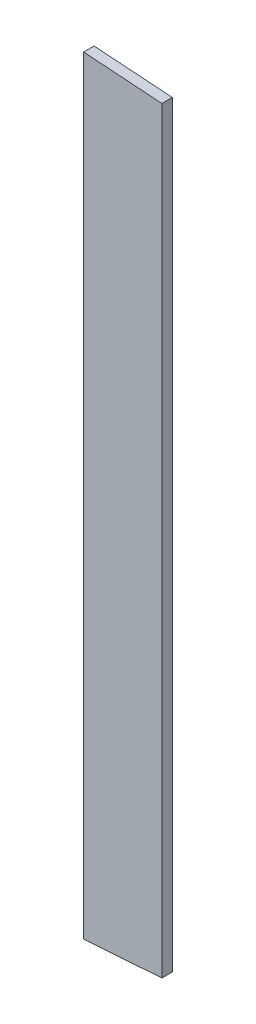
ISO-10303-21;
HEADER;
FILE_DESCRIPTION(('STEP AP214'),'2;1');
FILE_NAME('part.step','',(''),(''),'','','');
FILE_SCHEMA(('AUTOMOTIVE_DESIGN { 1 0 10303 214 1 1 1 1 }'));
ENDSEC;
DATA;
#1=APPLICATION_CONTEXT('core data for automotive mechanical design processes');
#2=APPLICATION_PROTOCOL_DEFINITION('international standard','automotive_design',2000,#1);
#3=PRODUCT_CONTEXT('',#1,'mechanical');
#4=PRODUCT('Part','Part','',(#3));
#5=PRODUCT_RELATED_PRODUCT_CATEGORY('part','',(#4));
#6=PRODUCT_DEFINITION_FORMATION('','',#4);
#7=PRODUCT_DEFINITION_CONTEXT('part definition',#1,'design');
#8=PRODUCT_DEFINITION('design','',#6,#7);
#9=PRODUCT_DEFINITION_SHAPE('','',#8);
#10=(LENGTH_UNIT() NAMED_UNIT(*) SI_UNIT(.MILLI.,.METRE.));
#11=(NAMED_UNIT(*) PLANE_ANGLE_UNIT() SI_UNIT($,.RADIAN.));
#12=(NAMED_UNIT(*) SI_UNIT($,.STERADIAN.) SOLID_ANGLE_UNIT());
#13=UNCERTAINTY_MEASURE_WITH_UNIT(LENGTH_MEASURE(1.E-05),#10,'distance_accuracy_value','');
#14=(GEOMETRIC_REPRESENTATION_CONTEXT(3) GLOBAL_UNCERTAINTY_ASSIGNED_CONTEXT((#13)) GLOBAL_UNIT_ASSIGNED_CONTEXT((#10,
#11,#12)) REPRESENTATION_CONTEXT('',''));
#15=CARTESIAN_POINT('',(0.,0.,0.));
#16=DIRECTION('',(0.,0.,1.));
#17=DIRECTION('',(1.,0.,0.));
#18=AXIS2_PLACEMENT_3D('',#15,#16,#17);
#19=CARTESIAN_POINT('',(-49.7696785157974,491.366899653588,3897.24999999915));
#20=DIRECTION('',(-1.,0.,0.));
#21=DIRECTION('',(0.,-1.,0.));
#22=AXIS2_PLACEMENT_3D('',#19,#20,#21);
#23=PLANE('',#22);
#24=DIRECTION('',(0.,1.,0.));
#25=VECTOR('',#24,1.);
#26=CARTESIAN_POINT('',(-49.7696785157974,491.366899653588,3895.24999999915));
#27=LINE('',#26,#25);
#28=CARTESIAN_POINT('',(-49.7696785157973,346.108282383898,3895.24999999915));
#29=VERTEX_POINT('',#28);
#30=CARTESIAN_POINT('',(-49.7696785157974,491.366899653588,3895.24999999915));
#31=VERTEX_POINT('',#30);
#32=EDGE_CURVE('E100',#29,#31,#27,.T.);
#33=ORIENTED_EDGE('',*,*,#32,.T.);
#34=DIRECTION('',(0.,0.,-1.));
#35=VECTOR('',#34,1.);
#36=CARTESIAN_POINT('',(-49.7696785157974,491.366899653588,3897.24999999915));
#37=LINE('',#36,#35);
#38=CARTESIAN_POINT('',(-49.7696785157974,491.366899653588,3897.24999999915));
#39=VERTEX_POINT('',#38);
#40=EDGE_CURVE('E11',#39,#31,#37,.T.);
#41=ORIENTED_EDGE('',*,*,#40,.F.);
#42=DIRECTION('',(0.,1.,0.));
#43=VECTOR('',#42,1.);
#44=CARTESIAN_POINT('',(-49.7696785157974,491.366899653588,3897.24999999915));
#45=LINE('',#44,#43);
#46=CARTESIAN_POINT('',(-49.7696785157973,346.108282383898,3897.24999999915));
#47=VERTEX_POINT('',#46);
#48=EDGE_CURVE('E88',#47,#39,#45,.T.);
#49=ORIENTED_EDGE('',*,*,#48,.F.);
#50=DIRECTION('',(0.,0.,-1.));
#51=VECTOR('',#50,1.);
#52=CARTESIAN_POINT('',(-49.7696785157973,346.108282383898,3897.24999999915));
#53=LINE('',#52,#51);
#54=EDGE_CURVE('E96',#47,#29,#53,.T.);
#55=ORIENTED_EDGE('',*,*,#54,.T.);
#56=EDGE_LOOP('',(#33,#41,#49,#55));
#57=FACE_BOUND('',#56,.T.);
#58=ADVANCED_FACE('F37',(#57),#23,.F.);
#59=CARTESIAN_POINT('',(-64.7696785157974,492.41580183274,3897.24999999915));
#60=DIRECTION('',(-0.0697564737441179,-0.997564050259825,0.));
#61=DIRECTION('',(0.997564050259825,-0.0697564737441179,0.));
#62=AXIS2_PLACEMENT_3D('',#59,#60,#61);
#63=PLANE('',#62);
#64=DIRECTION('',(-0.997564050259825,0.0697564737441179,0.));
#65=VECTOR('',#64,1.);
#66=CARTESIAN_POINT('',(-64.7696785157974,492.41580183274,3895.24999999915));
#67=LINE('',#66,#65);
#68=CARTESIAN_POINT('',(-64.7696785157974,492.41580183274,3895.24999999915));
#69=VERTEX_POINT('',#68);
#70=EDGE_CURVE('E92',#31,#69,#67,.T.);
#71=ORIENTED_EDGE('',*,*,#70,.T.);
#72=DIRECTION('',(0.,0.,-1.));
#73=VECTOR('',#72,1.);
#74=CARTESIAN_POINT('',(-64.7696785157974,492.41580183274,3897.24999999915));
#75=LINE('',#74,#73);
#76=CARTESIAN_POINT('',(-64.7696785157974,492.41580183274,3897.24999999915));
#77=VERTEX_POINT('',#76);
#78=EDGE_CURVE('E45',#77,#69,#75,.T.);
#79=ORIENTED_EDGE('',*,*,#78,.F.);
#80=DIRECTION('',(-0.997564050259825,0.0697564737441179,0.));
#81=VECTOR('',#80,1.);
#82=CARTESIAN_POINT('',(-64.7696785157974,492.41580183274,3897.24999999915));
#83=LINE('',#82,#81);
#84=EDGE_CURVE('E83',#39,#77,#83,.T.);
#85=ORIENTED_EDGE('',*,*,#84,.F.);
#86=ORIENTED_EDGE('',*,*,#40,.T.);
#87=EDGE_LOOP('',(#71,#79,#85,#86));
#88=FACE_BOUND('',#87,.T.);
#89=ADVANCED_FACE('F91',(#88),#63,.F.);
#90=CARTESIAN_POINT('',(-64.7696785157974,345.059380204746,3897.24999999915));
#91=DIRECTION('',(1.,0.,0.));
#92=DIRECTION('',(0.,1.,0.));
#93=AXIS2_PLACEMENT_3D('',#90,#91,#92);
#94=PLANE('',#93);
#95=DIRECTION('',(0.,-1.,0.));
#96=VECTOR('',#95,1.);
#97=CARTESIAN_POINT('',(-64.7696785157974,345.059380204746,3895.24999999915));
#98=LINE('',#97,#96);
#99=CARTESIAN_POINT('',(-64.7696785157974,345.059380204746,3895.24999999915));
#100=VERTEX_POINT('',#99);
#101=EDGE_CURVE('E70',#69,#100,#98,.T.);
#102=ORIENTED_EDGE('',*,*,#101,.T.);
#103=DIRECTION('',(0.,0.,-1.));
#104=VECTOR('',#103,1.);
#105=CARTESIAN_POINT('',(-64.7696785157974,345.059380204746,3897.24999999915));
#106=LINE('',#105,#104);
#107=CARTESIAN_POINT('',(-64.7696785157974,345.059380204746,3897.24999999915));
#108=VERTEX_POINT('',#107);
#109=EDGE_CURVE('E93',#108,#100,#106,.T.);
#110=ORIENTED_EDGE('',*,*,#109,.F.);
#111=DIRECTION('',(0.,-1.,0.));
#112=VECTOR('',#111,1.);
#113=CARTESIAN_POINT('',(-64.7696785157974,345.059380204746,3897.24999999915));
#114=LINE('',#113,#112);
#115=EDGE_CURVE('E86',#77,#108,#114,.T.);
#116=ORIENTED_EDGE('',*,*,#115,.F.);
#117=ORIENTED_EDGE('',*,*,#78,.T.);
#118=EDGE_LOOP('',(#102,#110,#116,#117));
#119=FACE_BOUND('',#118,.T.);
#120=ADVANCED_FACE('F94',(#119),#94,.F.);
#121=CARTESIAN_POINT('',(-49.7696785157973,346.108282383898,3897.24999999915));
#122=DIRECTION('',(-0.0697564737441178,0.997564050259825,0.));
#123=DIRECTION('',(-0.997564050259825,-0.0697564737441178,0.));
#124=AXIS2_PLACEMENT_3D('',#121,#122,#123);
#125=PLANE('',#124);
#126=DIRECTION('',(0.997564050259825,0.0697564737441178,0.));
#127=VECTOR('',#126,1.);
#128=CARTESIAN_POINT('',(-49.7696785157973,346.108282383898,3895.24999999915));
#129=LINE('',#128,#127);
#130=EDGE_CURVE('E76',#100,#29,#129,.T.);
#131=ORIENTED_EDGE('',*,*,#130,.T.);
#132=ORIENTED_EDGE('',*,*,#54,.F.);
#133=DIRECTION('',(0.997564050259825,0.0697564737441178,0.));
#134=VECTOR('',#133,1.);
#135=CARTESIAN_POINT('',(-49.7696785157973,346.108282383898,3897.24999999915));
#136=LINE('',#135,#134);
#137=EDGE_CURVE('E53',#108,#47,#136,.T.);
#138=ORIENTED_EDGE('',*,*,#137,.F.);
#139=ORIENTED_EDGE('',*,*,#109,.T.);
#140=EDGE_LOOP('',(#131,#132,#138,#139));
#141=FACE_BOUND('',#140,.T.);
#142=ADVANCED_FACE('F107',(#141),#125,.F.);
#143=CARTESIAN_POINT('',(0.,0.,3897.24999999915));
#144=DIRECTION('',(0.,0.,-1.));
#145=DIRECTION('',(-1.,0.,0.));
#146=AXIS2_PLACEMENT_3D('',#143,#144,#145);
#147=PLANE('',#146);
#148=ORIENTED_EDGE('',*,*,#48,.T.);
#149=ORIENTED_EDGE('',*,*,#84,.T.);
#150=ORIENTED_EDGE('',*,*,#115,.T.);
#151=ORIENTED_EDGE('',*,*,#137,.T.);
#152=EDGE_LOOP('',(#148,#149,#150,#151));
#153=FACE_BOUND('',#152,.T.);
#154=ADVANCED_FACE('F84',(#153),#147,.F.);
#155=CARTESIAN_POINT('',(0.,0.,3895.24999999915));
#156=DIRECTION('',(0.,0.,-1.));
#157=DIRECTION('',(-1.,0.,0.));
#158=AXIS2_PLACEMENT_3D('',#155,#156,#157);
#159=PLANE('',#158);
#160=ORIENTED_EDGE('',*,*,#32,.F.);
#161=ORIENTED_EDGE('',*,*,#130,.F.);
#162=ORIENTED_EDGE('',*,*,#101,.F.);
#163=ORIENTED_EDGE('',*,*,#70,.F.);
#164=EDGE_LOOP('',(#160,#161,#162,#163));
#165=FACE_BOUND('',#164,.T.);
#166=ADVANCED_FACE('F110',(#165),#159,.T.);
#167=CLOSED_SHELL('',(#58,#89,#120,#142,#154,#166));
#168=MANIFOLD_SOLID_BREP('B2',#167);
#169=ADVANCED_BREP_SHAPE_REPRESENTATION('',(#18,#168),#14);
#170=SHAPE_DEFINITION_REPRESENTATION(#9,#169);
ENDSEC;
END-ISO-10303-21;
